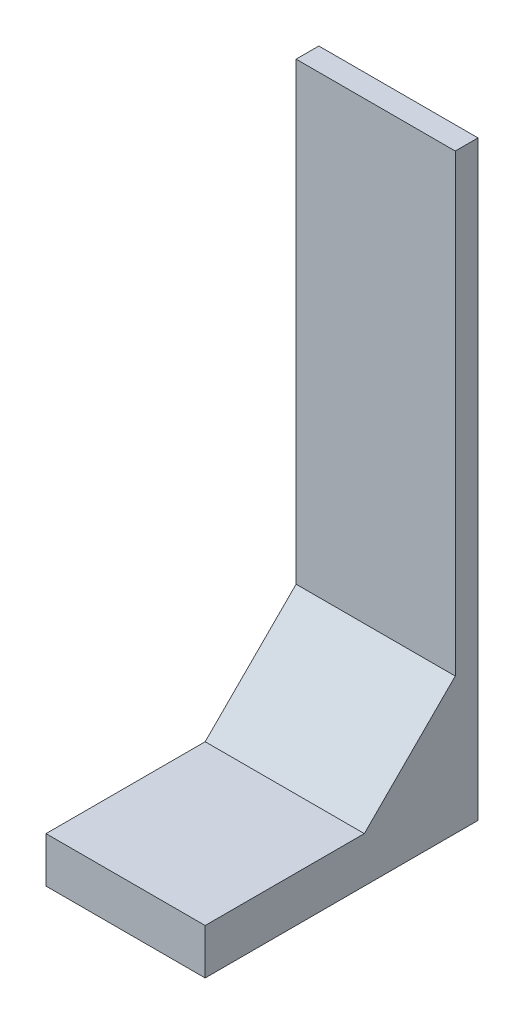
ISO-10303-21;
HEADER;
FILE_DESCRIPTION(('STEP AP214'),'2;1');
FILE_NAME('part.step','',(''),(''),'','','');
FILE_SCHEMA(('AUTOMOTIVE_DESIGN { 1 0 10303 214 1 1 1 1 }'));
ENDSEC;
DATA;
#1=APPLICATION_CONTEXT('core data for automotive mechanical design processes');
#2=APPLICATION_PROTOCOL_DEFINITION('international standard','automotive_design',2000,#1);
#3=PRODUCT_CONTEXT('',#1,'mechanical');
#4=PRODUCT('Part','Part','',(#3));
#5=PRODUCT_RELATED_PRODUCT_CATEGORY('part','',(#4));
#6=PRODUCT_DEFINITION_FORMATION('','',#4);
#7=PRODUCT_DEFINITION_CONTEXT('part definition',#1,'design');
#8=PRODUCT_DEFINITION('design','',#6,#7);
#9=PRODUCT_DEFINITION_SHAPE('','',#8);
#10=(LENGTH_UNIT() NAMED_UNIT(*) SI_UNIT(.MILLI.,.METRE.));
#11=(NAMED_UNIT(*) PLANE_ANGLE_UNIT() SI_UNIT($,.RADIAN.));
#12=(NAMED_UNIT(*) SI_UNIT($,.STERADIAN.) SOLID_ANGLE_UNIT());
#13=UNCERTAINTY_MEASURE_WITH_UNIT(LENGTH_MEASURE(1.E-05),#10,'distance_accuracy_value','');
#14=(GEOMETRIC_REPRESENTATION_CONTEXT(3) GLOBAL_UNCERTAINTY_ASSIGNED_CONTEXT((#13)) GLOBAL_UNIT_ASSIGNED_CONTEXT((#10,
#11,#12)) REPRESENTATION_CONTEXT('',''));
#15=CARTESIAN_POINT('',(0.,0.,0.));
#16=DIRECTION('',(0.,0.,1.));
#17=DIRECTION('',(1.,0.,0.));
#18=AXIS2_PLACEMENT_3D('',#15,#16,#17);
#19=CARTESIAN_POINT('',(22.225,0.,0.));
#20=DIRECTION('',(0.,1.,0.));
#21=DIRECTION('',(0.,0.,1.));
#22=AXIS2_PLACEMENT_3D('',#19,#20,#21);
#23=PLANE('',#22);
#24=DIRECTION('',(0.,0.,-1.));
#25=VECTOR('',#24,1.);
#26=CARTESIAN_POINT('',(-22.225,0.,0.));
#27=LINE('',#26,#25);
#28=CARTESIAN_POINT('',(-22.225,0.,76.2));
#29=VERTEX_POINT('',#28);
#30=CARTESIAN_POINT('',(-22.225,0.,0.));
#31=VERTEX_POINT('',#30);
#32=EDGE_CURVE('E131',#29,#31,#27,.T.);
#33=ORIENTED_EDGE('',*,*,#32,.T.);
#34=DIRECTION('',(-1.,0.,0.));
#35=VECTOR('',#34,1.);
#36=CARTESIAN_POINT('',(22.225,0.,0.));
#37=LINE('',#36,#35);
#38=CARTESIAN_POINT('',(22.225,0.,0.));
#39=VERTEX_POINT('',#38);
#40=EDGE_CURVE('E110',#39,#31,#37,.T.);
#41=ORIENTED_EDGE('',*,*,#40,.F.);
#42=DIRECTION('',(0.,0.,-1.));
#43=VECTOR('',#42,1.);
#44=CARTESIAN_POINT('',(22.225,0.,0.));
#45=LINE('',#44,#43);
#46=CARTESIAN_POINT('',(22.225,0.,76.2));
#47=VERTEX_POINT('',#46);
#48=EDGE_CURVE('E118',#47,#39,#45,.T.);
#49=ORIENTED_EDGE('',*,*,#48,.F.);
#50=DIRECTION('',(-1.,0.,0.));
#51=VECTOR('',#50,1.);
#52=CARTESIAN_POINT('',(22.225,0.,76.2));
#53=LINE('',#52,#51);
#54=EDGE_CURVE('E152',#47,#29,#53,.T.);
#55=ORIENTED_EDGE('',*,*,#54,.T.);
#56=EDGE_LOOP('',(#33,#41,#49,#55));
#57=FACE_BOUND('',#56,.T.);
#58=ADVANCED_FACE('F45',(#57),#23,.F.);
#59=CARTESIAN_POINT('',(22.225,0.,0.));
#60=DIRECTION('',(0.,0.,1.));
#61=DIRECTION('',(1.,0.,0.));
#62=AXIS2_PLACEMENT_3D('',#59,#60,#61);
#63=PLANE('',#62);
#64=DIRECTION('',(0.,1.,0.));
#65=VECTOR('',#64,1.);
#66=CARTESIAN_POINT('',(-22.225,0.,0.));
#67=LINE('',#66,#65);
#68=CARTESIAN_POINT('',(-22.225,165.1,0.));
#69=VERTEX_POINT('',#68);
#70=EDGE_CURVE('E166',#31,#69,#67,.T.);
#71=ORIENTED_EDGE('',*,*,#70,.T.);
#72=DIRECTION('',(-1.,0.,0.));
#73=VECTOR('',#72,1.);
#74=CARTESIAN_POINT('',(22.225,165.1,0.));
#75=LINE('',#74,#73);
#76=CARTESIAN_POINT('',(22.225,165.1,0.));
#77=VERTEX_POINT('',#76);
#78=EDGE_CURVE('E113',#77,#69,#75,.T.);
#79=ORIENTED_EDGE('',*,*,#78,.F.);
#80=DIRECTION('',(0.,1.,0.));
#81=VECTOR('',#80,1.);
#82=CARTESIAN_POINT('',(22.225,0.,0.));
#83=LINE('',#82,#81);
#84=EDGE_CURVE('E106',#39,#77,#83,.T.);
#85=ORIENTED_EDGE('',*,*,#84,.F.);
#86=ORIENTED_EDGE('',*,*,#40,.T.);
#87=EDGE_LOOP('',(#71,#79,#85,#86));
#88=FACE_BOUND('',#87,.T.);
#89=ADVANCED_FACE('F108',(#88),#63,.F.);
#90=CARTESIAN_POINT('',(22.225,165.1,0.));
#91=DIRECTION('',(0.,-1.,0.));
#92=DIRECTION('',(0.,0.,-1.));
#93=AXIS2_PLACEMENT_3D('',#90,#91,#92);
#94=PLANE('',#93);
#95=DIRECTION('',(0.,0.,1.));
#96=VECTOR('',#95,1.);
#97=CARTESIAN_POINT('',(-22.225,165.1,0.));
#98=LINE('',#97,#96);
#99=CARTESIAN_POINT('',(-22.225,165.1,6.35));
#100=VERTEX_POINT('',#99);
#101=EDGE_CURVE('E163',#69,#100,#98,.T.);
#102=ORIENTED_EDGE('',*,*,#101,.T.);
#103=DIRECTION('',(-1.,0.,0.));
#104=VECTOR('',#103,1.);
#105=CARTESIAN_POINT('',(22.225,165.1,6.35));
#106=LINE('',#105,#104);
#107=CARTESIAN_POINT('',(22.225,165.1,6.35));
#108=VERTEX_POINT('',#107);
#109=EDGE_CURVE('E139',#108,#100,#106,.T.);
#110=ORIENTED_EDGE('',*,*,#109,.F.);
#111=DIRECTION('',(0.,0.,1.));
#112=VECTOR('',#111,1.);
#113=CARTESIAN_POINT('',(22.225,165.1,0.));
#114=LINE('',#113,#112);
#115=EDGE_CURVE('E117',#77,#108,#114,.T.);
#116=ORIENTED_EDGE('',*,*,#115,.F.);
#117=ORIENTED_EDGE('',*,*,#78,.T.);
#118=EDGE_LOOP('',(#102,#110,#116,#117));
#119=FACE_BOUND('',#118,.T.);
#120=ADVANCED_FACE('F183',(#119),#94,.F.);
#121=CARTESIAN_POINT('',(22.225,165.1,6.35));
#122=DIRECTION('',(0.,0.,-1.));
#123=DIRECTION('',(0.,1.,0.));
#124=AXIS2_PLACEMENT_3D('',#121,#122,#123);
#125=PLANE('',#124);
#126=DIRECTION('',(0.,-1.,0.));
#127=VECTOR('',#126,1.);
#128=CARTESIAN_POINT('',(-22.225,165.1,6.35));
#129=LINE('',#128,#127);
#130=CARTESIAN_POINT('',(-22.225,38.1,6.34999999999999));
#131=VERTEX_POINT('',#130);
#132=EDGE_CURVE('E160',#100,#131,#129,.T.);
#133=ORIENTED_EDGE('',*,*,#132,.T.);
#134=DIRECTION('',(1.,0.,0.));
#135=VECTOR('',#134,1.);
#136=CARTESIAN_POINT('',(22.225,38.0999999999999,6.34999999999999));
#137=LINE('',#136,#135);
#138=CARTESIAN_POINT('',(22.225,38.1,6.34999999999999));
#139=VERTEX_POINT('',#138);
#140=EDGE_CURVE('E62',#131,#139,#137,.T.);
#141=ORIENTED_EDGE('',*,*,#140,.T.);
#142=DIRECTION('',(0.,-1.,0.));
#143=VECTOR('',#142,1.);
#144=CARTESIAN_POINT('',(22.225,165.1,6.35));
#145=LINE('',#144,#143);
#146=EDGE_CURVE('E176',#108,#139,#145,.T.);
#147=ORIENTED_EDGE('',*,*,#146,.F.);
#148=ORIENTED_EDGE('',*,*,#109,.T.);
#149=EDGE_LOOP('',(#133,#141,#147,#148));
#150=FACE_BOUND('',#149,.T.);
#151=ADVANCED_FACE('F185',(#150),#125,.F.);
#152=CARTESIAN_POINT('',(22.225,12.7,6.34999999999998));
#153=DIRECTION('',(0.,-1.,0.));
#154=DIRECTION('',(0.,0.,-1.));
#155=AXIS2_PLACEMENT_3D('',#152,#153,#154);
#156=PLANE('',#155);
#157=DIRECTION('',(0.,0.,1.));
#158=VECTOR('',#157,1.);
#159=CARTESIAN_POINT('',(22.225,12.7,6.34999999999998));
#160=LINE('',#159,#158);
#161=CARTESIAN_POINT('',(22.225,12.7,31.7500000000002));
#162=VERTEX_POINT('',#161);
#163=CARTESIAN_POINT('',(22.225,12.7,76.2));
#164=VERTEX_POINT('',#163);
#165=EDGE_CURVE('E173',#162,#164,#160,.T.);
#166=ORIENTED_EDGE('',*,*,#165,.F.);
#167=DIRECTION('',(-1.,0.,0.));
#168=VECTOR('',#167,1.);
#169=CARTESIAN_POINT('',(-22.225,12.7,31.7500000000002));
#170=LINE('',#169,#168);
#171=CARTESIAN_POINT('',(-22.225,12.7,31.7500000000002));
#172=VERTEX_POINT('',#171);
#173=EDGE_CURVE('E133',#162,#172,#170,.T.);
#174=ORIENTED_EDGE('',*,*,#173,.T.);
#175=DIRECTION('',(0.,0.,1.));
#176=VECTOR('',#175,1.);
#177=CARTESIAN_POINT('',(-22.225,12.7,6.34999999999998));
#178=LINE('',#177,#176);
#179=CARTESIAN_POINT('',(-22.225,12.7,76.2));
#180=VERTEX_POINT('',#179);
#181=EDGE_CURVE('E157',#172,#180,#178,.T.);
#182=ORIENTED_EDGE('',*,*,#181,.T.);
#183=DIRECTION('',(-1.,0.,0.));
#184=VECTOR('',#183,1.);
#185=CARTESIAN_POINT('',(22.225,12.7,76.2));
#186=LINE('',#185,#184);
#187=EDGE_CURVE('E148',#164,#180,#186,.T.);
#188=ORIENTED_EDGE('',*,*,#187,.F.);
#189=EDGE_LOOP('',(#166,#174,#182,#188));
#190=FACE_BOUND('',#189,.T.);
#191=ADVANCED_FACE('F187',(#190),#156,.F.);
#192=CARTESIAN_POINT('',(22.225,0.,76.2));
#193=DIRECTION('',(0.,0.,-1.));
#194=DIRECTION('',(-1.,0.,0.));
#195=AXIS2_PLACEMENT_3D('',#192,#193,#194);
#196=PLANE('',#195);
#197=DIRECTION('',(0.,-1.,0.));
#198=VECTOR('',#197,1.);
#199=CARTESIAN_POINT('',(-22.225,0.,76.2));
#200=LINE('',#199,#198);
#201=EDGE_CURVE('E128',#180,#29,#200,.T.);
#202=ORIENTED_EDGE('',*,*,#201,.T.);
#203=ORIENTED_EDGE('',*,*,#54,.F.);
#204=DIRECTION('',(0.,-1.,0.));
#205=VECTOR('',#204,1.);
#206=CARTESIAN_POINT('',(22.225,0.,76.2));
#207=LINE('',#206,#205);
#208=EDGE_CURVE('E123',#164,#47,#207,.T.);
#209=ORIENTED_EDGE('',*,*,#208,.F.);
#210=ORIENTED_EDGE('',*,*,#187,.T.);
#211=EDGE_LOOP('',(#202,#203,#209,#210));
#212=FACE_BOUND('',#211,.T.);
#213=ADVANCED_FACE('F193',(#212),#196,.F.);
#214=CARTESIAN_POINT('',(22.225,0.,0.));
#215=DIRECTION('',(-1.,0.,0.));
#216=DIRECTION('',(0.,0.,1.));
#217=AXIS2_PLACEMENT_3D('',#214,#215,#216);
#218=PLANE('',#217);
#219=ORIENTED_EDGE('',*,*,#48,.T.);
#220=ORIENTED_EDGE('',*,*,#84,.T.);
#221=ORIENTED_EDGE('',*,*,#115,.T.);
#222=ORIENTED_EDGE('',*,*,#146,.T.);
#223=DIRECTION('',(0.,0.707106781186544,-0.707106781186552));
#224=VECTOR('',#223,1.);
#225=CARTESIAN_POINT('',(22.225,22.2250000000002,22.2249999999999));
#226=LINE('',#225,#224);
#227=EDGE_CURVE('E11',#139,#162,#226,.F.);
#228=ORIENTED_EDGE('',*,*,#227,.T.);
#229=ORIENTED_EDGE('',*,*,#165,.T.);
#230=ORIENTED_EDGE('',*,*,#208,.T.);
#231=EDGE_LOOP('',(#219,#220,#221,#222,#228,#229,#230));
#232=FACE_BOUND('',#231,.T.);
#233=ADVANCED_FACE('F121',(#232),#218,.F.);
#234=CARTESIAN_POINT('',(-22.225,0.,0.));
#235=DIRECTION('',(-1.,0.,0.));
#236=DIRECTION('',(0.,0.,1.));
#237=AXIS2_PLACEMENT_3D('',#234,#235,#236);
#238=PLANE('',#237);
#239=ORIENTED_EDGE('',*,*,#32,.F.);
#240=ORIENTED_EDGE('',*,*,#201,.F.);
#241=ORIENTED_EDGE('',*,*,#181,.F.);
#242=DIRECTION('',(0.,-0.707106781186544,0.707106781186552));
#243=VECTOR('',#242,1.);
#244=CARTESIAN_POINT('',(-22.225,12.7,31.7500000000002));
#245=LINE('',#244,#243);
#246=EDGE_CURVE('E55',#172,#131,#245,.F.);
#247=ORIENTED_EDGE('',*,*,#246,.T.);
#248=ORIENTED_EDGE('',*,*,#132,.F.);
#249=ORIENTED_EDGE('',*,*,#101,.F.);
#250=ORIENTED_EDGE('',*,*,#70,.F.);
#251=EDGE_LOOP('',(#239,#240,#241,#247,#248,#249,#250));
#252=FACE_BOUND('',#251,.T.);
#253=ADVANCED_FACE('F240',(#252),#238,.T.);
#254=CARTESIAN_POINT('',(22.225,12.7,31.7500000000002));
#255=DIRECTION('',(0.,0.707106781186552,0.707106781186544));
#256=DIRECTION('',(1.,0.,0.));
#257=AXIS2_PLACEMENT_3D('',#254,#255,#256);
#258=PLANE('',#257);
#259=ORIENTED_EDGE('',*,*,#227,.F.);
#260=ORIENTED_EDGE('',*,*,#140,.F.);
#261=ORIENTED_EDGE('',*,*,#246,.F.);
#262=ORIENTED_EDGE('',*,*,#173,.F.);
#263=EDGE_LOOP('',(#259,#260,#261,#262));
#264=FACE_BOUND('',#263,.T.);
#265=ADVANCED_FACE('F48',(#264),#258,.T.);
#266=CLOSED_SHELL('',(#58,#89,#120,#151,#191,#213,#233,#253,#265));
#267=MANIFOLD_SOLID_BREP('B2',#266);
#268=ADVANCED_BREP_SHAPE_REPRESENTATION('',(#18,#267),#14);
#269=SHAPE_DEFINITION_REPRESENTATION(#9,#268);
ENDSEC;
END-ISO-10303-21;
